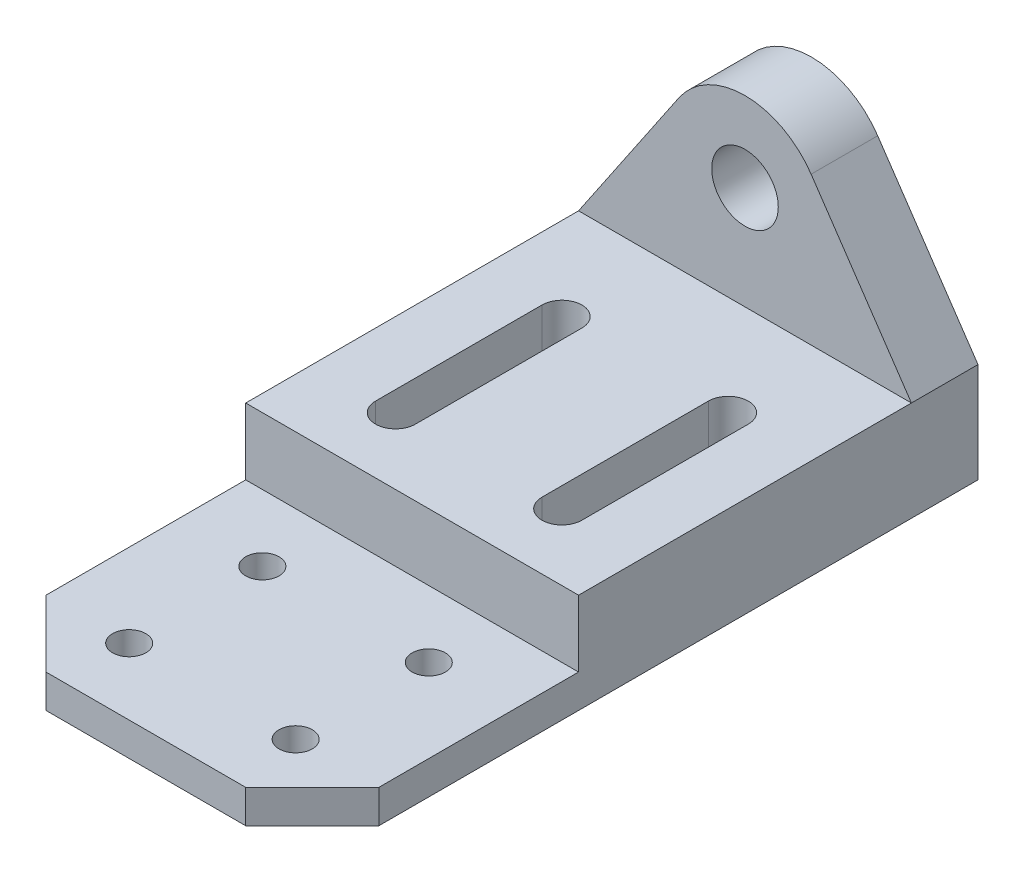
ISO-10303-21;
HEADER;
FILE_DESCRIPTION(('STEP AP214'),'2;1');
FILE_NAME('part.step','',(''),(''),'','','');
FILE_SCHEMA(('AUTOMOTIVE_DESIGN { 1 0 10303 214 1 1 1 1 }'));
ENDSEC;
DATA;
#1=APPLICATION_CONTEXT('core data for automotive mechanical design processes');
#2=APPLICATION_PROTOCOL_DEFINITION('international standard','automotive_design',2000,#1);
#3=PRODUCT_CONTEXT('',#1,'mechanical');
#4=PRODUCT('Part','Part','',(#3));
#5=PRODUCT_RELATED_PRODUCT_CATEGORY('part','',(#4));
#6=PRODUCT_DEFINITION_FORMATION('','',#4);
#7=PRODUCT_DEFINITION_CONTEXT('part definition',#1,'design');
#8=PRODUCT_DEFINITION('design','',#6,#7);
#9=PRODUCT_DEFINITION_SHAPE('','',#8);
#10=(LENGTH_UNIT() NAMED_UNIT(*) SI_UNIT(.MILLI.,.METRE.));
#11=(NAMED_UNIT(*) PLANE_ANGLE_UNIT() SI_UNIT($,.RADIAN.));
#12=(NAMED_UNIT(*) SI_UNIT($,.STERADIAN.) SOLID_ANGLE_UNIT());
#13=UNCERTAINTY_MEASURE_WITH_UNIT(LENGTH_MEASURE(1.E-05),#10,'distance_accuracy_value','');
#14=(GEOMETRIC_REPRESENTATION_CONTEXT(3) GLOBAL_UNCERTAINTY_ASSIGNED_CONTEXT((#13)) GLOBAL_UNIT_ASSIGNED_CONTEXT((#10,
#11,#12)) REPRESENTATION_CONTEXT('',''));
#15=CARTESIAN_POINT('',(0.,0.,0.));
#16=DIRECTION('',(0.,0.,1.));
#17=DIRECTION('',(1.,0.,0.));
#18=AXIS2_PLACEMENT_3D('',#15,#16,#17);
#19=CARTESIAN_POINT('',(-50.,30.,-80.));
#20=DIRECTION('',(0.,1.,0.));
#21=DIRECTION('',(0.,0.,1.));
#22=AXIS2_PLACEMENT_3D('',#19,#20,#21);
#23=PLANE('',#22);
#24=CARTESIAN_POINT('',(-25.,30.,-50.));
#25=DIRECTION('',(0.,1.,0.));
#26=DIRECTION('',(0.,0.,1.));
#27=AXIS2_PLACEMENT_3D('',#24,#25,#26);
#28=CIRCLE('',#27,6.);
#29=CARTESIAN_POINT('',(-19.,30.,-50.));
#30=VERTEX_POINT('',#29);
#31=CARTESIAN_POINT('',(-31.,30.,-50.));
#32=VERTEX_POINT('',#31);
#33=EDGE_CURVE('E240',#30,#32,#28,.T.);
#34=ORIENTED_EDGE('',*,*,#33,.F.);
#35=DIRECTION('',(0.,0.,-1.));
#36=VECTOR('',#35,1.);
#37=CARTESIAN_POINT('',(-19.,30.,-50.));
#38=LINE('',#37,#36);
#39=CARTESIAN_POINT('',(-19.,30.,0.));
#40=VERTEX_POINT('',#39);
#41=EDGE_CURVE('E229',#40,#30,#38,.T.);
#42=ORIENTED_EDGE('',*,*,#41,.F.);
#43=CARTESIAN_POINT('',(-25.,30.,0.));
#44=DIRECTION('',(0.,1.,0.));
#45=DIRECTION('',(0.,0.,1.));
#46=AXIS2_PLACEMENT_3D('',#43,#44,#45);
#47=CIRCLE('',#46,6.);
#48=CARTESIAN_POINT('',(-31.,30.,0.));
#49=VERTEX_POINT('',#48);
#50=EDGE_CURVE('E248',#49,#40,#47,.T.);
#51=ORIENTED_EDGE('',*,*,#50,.F.);
#52=DIRECTION('',(0.,0.,1.));
#53=VECTOR('',#52,1.);
#54=CARTESIAN_POINT('',(-31.,30.,-50.));
#55=LINE('',#54,#53);
#56=EDGE_CURVE('E243',#32,#49,#55,.T.);
#57=ORIENTED_EDGE('',*,*,#56,.F.);
#58=EDGE_LOOP('',(#34,#42,#51,#57));
#59=FACE_BOUND('',#58,.T.);
#60=CARTESIAN_POINT('',(25.,30.,-50.));
#61=DIRECTION('',(0.,1.,0.));
#62=DIRECTION('',(0.,0.,-1.));
#63=AXIS2_PLACEMENT_3D('',#60,#61,#62);
#64=CIRCLE('',#63,6.);
#65=CARTESIAN_POINT('',(31.,30.,-50.));
#66=VERTEX_POINT('',#65);
#67=CARTESIAN_POINT('',(19.,30.,-50.));
#68=VERTEX_POINT('',#67);
#69=EDGE_CURVE('E244',#66,#68,#64,.T.);
#70=ORIENTED_EDGE('',*,*,#69,.F.);
#71=DIRECTION('',(0.,0.,-1.));
#72=VECTOR('',#71,1.);
#73=CARTESIAN_POINT('',(31.,30.,-50.));
#74=LINE('',#73,#72);
#75=CARTESIAN_POINT('',(31.,30.,0.));
#76=VERTEX_POINT('',#75);
#77=EDGE_CURVE('E281',#76,#66,#74,.T.);
#78=ORIENTED_EDGE('',*,*,#77,.F.);
#79=CARTESIAN_POINT('',(25.,30.,0.));
#80=DIRECTION('',(0.,1.,0.));
#81=DIRECTION('',(0.,0.,-1.));
#82=AXIS2_PLACEMENT_3D('',#79,#80,#81);
#83=CIRCLE('',#82,6.);
#84=CARTESIAN_POINT('',(19.,30.,0.));
#85=VERTEX_POINT('',#84);
#86=EDGE_CURVE('E285',#85,#76,#83,.T.);
#87=ORIENTED_EDGE('',*,*,#86,.F.);
#88=DIRECTION('',(0.,0.,1.));
#89=VECTOR('',#88,1.);
#90=CARTESIAN_POINT('',(19.,30.,-50.));
#91=LINE('',#90,#89);
#92=EDGE_CURVE('E290',#68,#85,#91,.T.);
#93=ORIENTED_EDGE('',*,*,#92,.F.);
#94=EDGE_LOOP('',(#70,#78,#87,#93));
#95=FACE_BOUND('',#94,.T.);
#96=DIRECTION('',(0.,0.,1.));
#97=VECTOR('',#96,1.);
#98=CARTESIAN_POINT('',(50.,30.,-80.));
#99=LINE('',#98,#97);
#100=CARTESIAN_POINT('',(50.,30.,-80.));
#101=VERTEX_POINT('',#100);
#102=CARTESIAN_POINT('',(50.,30.,20.));
#103=VERTEX_POINT('',#102);
#104=EDGE_CURVE('E348',#101,#103,#99,.T.);
#105=ORIENTED_EDGE('',*,*,#104,.F.);
#106=DIRECTION('',(-1.,0.,0.));
#107=VECTOR('',#106,1.);
#108=CARTESIAN_POINT('',(-50.,30.,-80.));
#109=LINE('',#108,#107);
#110=CARTESIAN_POINT('',(-50.,30.,-80.));
#111=VERTEX_POINT('',#110);
#112=EDGE_CURVE('E191',#101,#111,#109,.T.);
#113=ORIENTED_EDGE('',*,*,#112,.T.);
#114=DIRECTION('',(0.,0.,1.));
#115=VECTOR('',#114,1.);
#116=CARTESIAN_POINT('',(-50.,30.,-80.));
#117=LINE('',#116,#115);
#118=CARTESIAN_POINT('',(-50.,30.,20.));
#119=VERTEX_POINT('',#118);
#120=EDGE_CURVE('E368',#111,#119,#117,.T.);
#121=ORIENTED_EDGE('',*,*,#120,.T.);
#122=DIRECTION('',(1.,0.,0.));
#123=VECTOR('',#122,1.);
#124=CARTESIAN_POINT('',(-50.,30.,20.));
#125=LINE('',#124,#123);
#126=EDGE_CURVE('E388',#119,#103,#125,.T.);
#127=ORIENTED_EDGE('',*,*,#126,.T.);
#128=EDGE_LOOP('',(#105,#113,#121,#127));
#129=FACE_BOUND('',#128,.T.);
#130=ADVANCED_FACE('F47',(#59,#95,#129),#23,.T.);
#131=CARTESIAN_POINT('',(-50.,0.,100.));
#132=DIRECTION('',(0.,-1.,0.));
#133=DIRECTION('',(0.,0.,-1.));
#134=AXIS2_PLACEMENT_3D('',#131,#132,#133);
#135=PLANE('',#134);
#136=CARTESIAN_POINT('',(-25.,0.,-50.));
#137=DIRECTION('',(0.,1.,0.));
#138=DIRECTION('',(0.,0.,1.));
#139=AXIS2_PLACEMENT_3D('',#136,#137,#138);
#140=CIRCLE('',#139,6.);
#141=CARTESIAN_POINT('',(-19.,0.,-50.));
#142=VERTEX_POINT('',#141);
#143=CARTESIAN_POINT('',(-31.,0.,-50.));
#144=VERTEX_POINT('',#143);
#145=EDGE_CURVE('E224',#142,#144,#140,.T.);
#146=ORIENTED_EDGE('',*,*,#145,.T.);
#147=DIRECTION('',(0.,0.,1.));
#148=VECTOR('',#147,1.);
#149=CARTESIAN_POINT('',(-31.,0.,-50.));
#150=LINE('',#149,#148);
#151=CARTESIAN_POINT('',(-31.,0.,0.));
#152=VERTEX_POINT('',#151);
#153=EDGE_CURVE('E228',#144,#152,#150,.T.);
#154=ORIENTED_EDGE('',*,*,#153,.T.);
#155=CARTESIAN_POINT('',(-25.,0.,0.));
#156=DIRECTION('',(0.,1.,0.));
#157=DIRECTION('',(0.,0.,1.));
#158=AXIS2_PLACEMENT_3D('',#155,#156,#157);
#159=CIRCLE('',#158,6.);
#160=CARTESIAN_POINT('',(-19.,0.,0.));
#161=VERTEX_POINT('',#160);
#162=EDGE_CURVE('E72',#152,#161,#159,.T.);
#163=ORIENTED_EDGE('',*,*,#162,.T.);
#164=DIRECTION('',(0.,0.,-1.));
#165=VECTOR('',#164,1.);
#166=CARTESIAN_POINT('',(-19.,0.,-50.));
#167=LINE('',#166,#165);
#168=EDGE_CURVE('E235',#161,#142,#167,.T.);
#169=ORIENTED_EDGE('',*,*,#168,.T.);
#170=EDGE_LOOP('',(#146,#154,#163,#169));
#171=FACE_BOUND('',#170,.T.);
#172=CARTESIAN_POINT('',(25.,0.,-50.));
#173=DIRECTION('',(0.,1.,0.));
#174=DIRECTION('',(0.,0.,-1.));
#175=AXIS2_PLACEMENT_3D('',#172,#173,#174);
#176=CIRCLE('',#175,6.);
#177=CARTESIAN_POINT('',(31.,0.,-50.));
#178=VERTEX_POINT('',#177);
#179=CARTESIAN_POINT('',(19.,0.,-50.));
#180=VERTEX_POINT('',#179);
#181=EDGE_CURVE('E286',#178,#180,#176,.T.);
#182=ORIENTED_EDGE('',*,*,#181,.T.);
#183=DIRECTION('',(0.,0.,1.));
#184=VECTOR('',#183,1.);
#185=CARTESIAN_POINT('',(19.,0.,-50.));
#186=LINE('',#185,#184);
#187=CARTESIAN_POINT('',(19.,0.,0.));
#188=VERTEX_POINT('',#187);
#189=EDGE_CURVE('E303',#180,#188,#186,.T.);
#190=ORIENTED_EDGE('',*,*,#189,.T.);
#191=CARTESIAN_POINT('',(25.,0.,0.));
#192=DIRECTION('',(0.,1.,0.));
#193=DIRECTION('',(0.,0.,-1.));
#194=AXIS2_PLACEMENT_3D('',#191,#192,#193);
#195=CIRCLE('',#194,6.);
#196=CARTESIAN_POINT('',(31.,0.,0.));
#197=VERTEX_POINT('',#196);
#198=EDGE_CURVE('E299',#188,#197,#195,.T.);
#199=ORIENTED_EDGE('',*,*,#198,.T.);
#200=DIRECTION('',(0.,0.,-1.));
#201=VECTOR('',#200,1.);
#202=CARTESIAN_POINT('',(31.,0.,-50.));
#203=LINE('',#202,#201);
#204=EDGE_CURVE('E272',#197,#178,#203,.T.);
#205=ORIENTED_EDGE('',*,*,#204,.T.);
#206=EDGE_LOOP('',(#182,#190,#199,#205));
#207=FACE_BOUND('',#206,.T.);
#208=DIRECTION('',(1.,0.,0.));
#209=VECTOR('',#208,1.);
#210=CARTESIAN_POINT('',(-50.,0.,100.));
#211=LINE('',#210,#209);
#212=CARTESIAN_POINT('',(-30.,0.,100.));
#213=VERTEX_POINT('',#212);
#214=CARTESIAN_POINT('',(29.9999999999999,0.,100.));
#215=VERTEX_POINT('',#214);
#216=EDGE_CURVE('E379',#213,#215,#211,.T.);
#217=ORIENTED_EDGE('',*,*,#216,.F.);
#218=DIRECTION('',(-0.707106781186548,0.,-0.707106781186548));
#219=VECTOR('',#218,1.);
#220=CARTESIAN_POINT('',(-40.,0.,90.));
#221=LINE('',#220,#219);
#222=CARTESIAN_POINT('',(-50.,0.,80.));
#223=VERTEX_POINT('',#222);
#224=EDGE_CURVE('E408',#213,#223,#221,.T.);
#225=ORIENTED_EDGE('',*,*,#224,.T.);
#226=DIRECTION('',(0.,0.,-1.));
#227=VECTOR('',#226,1.);
#228=CARTESIAN_POINT('',(-50.,0.,100.));
#229=LINE('',#228,#227);
#230=CARTESIAN_POINT('',(-50.,0.,-100.));
#231=VERTEX_POINT('',#230);
#232=EDGE_CURVE('E361',#223,#231,#229,.T.);
#233=ORIENTED_EDGE('',*,*,#232,.T.);
#234=DIRECTION('',(1.,0.,0.));
#235=VECTOR('',#234,1.);
#236=CARTESIAN_POINT('',(-50.,0.,-100.));
#237=LINE('',#236,#235);
#238=CARTESIAN_POINT('',(50.,0.,-100.));
#239=VERTEX_POINT('',#238);
#240=EDGE_CURVE('E392',#231,#239,#237,.T.);
#241=ORIENTED_EDGE('',*,*,#240,.T.);
#242=DIRECTION('',(0.,0.,-1.));
#243=VECTOR('',#242,1.);
#244=CARTESIAN_POINT('',(50.,0.,100.));
#245=LINE('',#244,#243);
#246=CARTESIAN_POINT('',(50.,0.,79.9999999999999));
#247=VERTEX_POINT('',#246);
#248=EDGE_CURVE('E341',#247,#239,#245,.T.);
#249=ORIENTED_EDGE('',*,*,#248,.F.);
#250=DIRECTION('',(0.707106781186548,0.,-0.707106781186548));
#251=VECTOR('',#250,1.);
#252=CARTESIAN_POINT('',(-10.,0.,140.));
#253=LINE('',#252,#251);
#254=EDGE_CURVE('E405',#247,#215,#253,.F.);
#255=ORIENTED_EDGE('',*,*,#254,.T.);
#256=EDGE_LOOP('',(#217,#225,#233,#241,#249,#255));
#257=FACE_BOUND('',#256,.T.);
#258=CARTESIAN_POINT('',(-25.,0.,80.));
#259=DIRECTION('',(0.,1.,0.));
#260=DIRECTION('',(0.,0.,1.));
#261=AXIS2_PLACEMENT_3D('',#258,#259,#260);
#262=CIRCLE('',#261,5.00000000000002);
#263=CARTESIAN_POINT('',(-25.,0.,85.));
#264=VERTEX_POINT('',#263);
#265=EDGE_CURVE('E337',#264,#264,#262,.T.);
#266=ORIENTED_EDGE('',*,*,#265,.T.);
#267=EDGE_LOOP('',(#266));
#268=FACE_BOUND('',#267,.T.);
#269=CARTESIAN_POINT('',(-25.,0.,40.));
#270=DIRECTION('',(0.,1.,0.));
#271=DIRECTION('',(0.,0.,1.));
#272=AXIS2_PLACEMENT_3D('',#269,#270,#271);
#273=CIRCLE('',#272,5.00000000000002);
#274=CARTESIAN_POINT('',(-25.,0.,45.));
#275=VERTEX_POINT('',#274);
#276=EDGE_CURVE('E329',#275,#275,#273,.T.);
#277=ORIENTED_EDGE('',*,*,#276,.T.);
#278=EDGE_LOOP('',(#277));
#279=FACE_BOUND('',#278,.T.);
#280=CARTESIAN_POINT('',(25.,0.,80.));
#281=DIRECTION('',(0.,1.,0.));
#282=DIRECTION('',(0.,0.,1.));
#283=AXIS2_PLACEMENT_3D('',#280,#281,#282);
#284=CIRCLE('',#283,5.00000000000002);
#285=CARTESIAN_POINT('',(25.,0.,85.));
#286=VERTEX_POINT('',#285);
#287=EDGE_CURVE('E321',#286,#286,#284,.T.);
#288=ORIENTED_EDGE('',*,*,#287,.T.);
#289=EDGE_LOOP('',(#288));
#290=FACE_BOUND('',#289,.T.);
#291=CARTESIAN_POINT('',(25.,0.,40.));
#292=DIRECTION('',(0.,1.,0.));
#293=DIRECTION('',(0.,0.,1.));
#294=AXIS2_PLACEMENT_3D('',#291,#292,#293);
#295=CIRCLE('',#294,5.00000000000002);
#296=CARTESIAN_POINT('',(25.,0.,45.));
#297=VERTEX_POINT('',#296);
#298=EDGE_CURVE('E313',#297,#297,#295,.T.);
#299=ORIENTED_EDGE('',*,*,#298,.T.);
#300=EDGE_LOOP('',(#299));
#301=FACE_BOUND('',#300,.T.);
#302=ADVANCED_FACE('F433',(#171,#207,#257,#268,#279,#290,#301),#135,.T.);
#303=CARTESIAN_POINT('',(-50.,10.,100.));
#304=DIRECTION('',(0.,0.,1.));
#305=DIRECTION('',(1.,0.,0.));
#306=AXIS2_PLACEMENT_3D('',#303,#304,#305);
#307=PLANE('',#306);
#308=DIRECTION('',(1.,0.,0.));
#309=VECTOR('',#308,1.);
#310=CARTESIAN_POINT('',(-50.,10.,100.));
#311=LINE('',#310,#309);
#312=CARTESIAN_POINT('',(-30.,10.,100.));
#313=VERTEX_POINT('',#312);
#314=CARTESIAN_POINT('',(29.9999999999999,10.,100.));
#315=VERTEX_POINT('',#314);
#316=EDGE_CURVE('E380',#313,#315,#311,.T.);
#317=ORIENTED_EDGE('',*,*,#316,.F.);
#318=DIRECTION('',(0.,-1.,0.));
#319=VECTOR('',#318,1.);
#320=CARTESIAN_POINT('',(-30.,0.,100.));
#321=LINE('',#320,#319);
#322=EDGE_CURVE('E401',#313,#213,#321,.T.);
#323=ORIENTED_EDGE('',*,*,#322,.T.);
#324=ORIENTED_EDGE('',*,*,#216,.T.);
#325=DIRECTION('',(0.,1.,0.));
#326=VECTOR('',#325,1.);
#327=CARTESIAN_POINT('',(29.9999999999999,10.,100.));
#328=LINE('',#327,#326);
#329=EDGE_CURVE('E384',#215,#315,#328,.T.);
#330=ORIENTED_EDGE('',*,*,#329,.T.);
#331=EDGE_LOOP('',(#317,#323,#324,#330));
#332=FACE_BOUND('',#331,.T.);
#333=ADVANCED_FACE('F427',(#332),#307,.T.);
#334=CARTESIAN_POINT('',(-50.,10.,20.));
#335=DIRECTION('',(0.,1.,0.));
#336=DIRECTION('',(0.,0.,1.));
#337=AXIS2_PLACEMENT_3D('',#334,#335,#336);
#338=PLANE('',#337);
#339=CARTESIAN_POINT('',(25.,10.,40.));
#340=DIRECTION('',(0.,1.,0.));
#341=DIRECTION('',(0.,0.,1.));
#342=AXIS2_PLACEMENT_3D('',#339,#340,#341);
#343=CIRCLE('',#342,5.00000000000002);
#344=CARTESIAN_POINT('',(25.,10.,45.));
#345=VERTEX_POINT('',#344);
#346=EDGE_CURVE('E258',#345,#345,#343,.T.);
#347=ORIENTED_EDGE('',*,*,#346,.F.);
#348=EDGE_LOOP('',(#347));
#349=FACE_BOUND('',#348,.T.);
#350=CARTESIAN_POINT('',(25.,10.,80.));
#351=DIRECTION('',(0.,1.,0.));
#352=DIRECTION('',(0.,0.,1.));
#353=AXIS2_PLACEMENT_3D('',#350,#351,#352);
#354=CIRCLE('',#353,5.00000000000002);
#355=CARTESIAN_POINT('',(25.,10.,85.));
#356=VERTEX_POINT('',#355);
#357=EDGE_CURVE('E317',#356,#356,#354,.T.);
#358=ORIENTED_EDGE('',*,*,#357,.F.);
#359=EDGE_LOOP('',(#358));
#360=FACE_BOUND('',#359,.T.);
#361=CARTESIAN_POINT('',(-25.,10.,40.));
#362=DIRECTION('',(0.,1.,0.));
#363=DIRECTION('',(0.,0.,1.));
#364=AXIS2_PLACEMENT_3D('',#361,#362,#363);
#365=CIRCLE('',#364,5.00000000000002);
#366=CARTESIAN_POINT('',(-25.,10.,45.));
#367=VERTEX_POINT('',#366);
#368=EDGE_CURVE('E325',#367,#367,#365,.T.);
#369=ORIENTED_EDGE('',*,*,#368,.F.);
#370=EDGE_LOOP('',(#369));
#371=FACE_BOUND('',#370,.T.);
#372=CARTESIAN_POINT('',(-25.,10.,80.));
#373=DIRECTION('',(0.,1.,0.));
#374=DIRECTION('',(0.,0.,1.));
#375=AXIS2_PLACEMENT_3D('',#372,#373,#374);
#376=CIRCLE('',#375,5.00000000000002);
#377=CARTESIAN_POINT('',(-25.,10.,85.));
#378=VERTEX_POINT('',#377);
#379=EDGE_CURVE('E333',#378,#378,#376,.T.);
#380=ORIENTED_EDGE('',*,*,#379,.F.);
#381=EDGE_LOOP('',(#380));
#382=FACE_BOUND('',#381,.T.);
#383=DIRECTION('',(0.,0.,1.));
#384=VECTOR('',#383,1.);
#385=CARTESIAN_POINT('',(-50.,10.,20.));
#386=LINE('',#385,#384);
#387=CARTESIAN_POINT('',(-50.,10.,20.));
#388=VERTEX_POINT('',#387);
#389=CARTESIAN_POINT('',(-50.,10.,80.));
#390=VERTEX_POINT('',#389);
#391=EDGE_CURVE('E375',#388,#390,#386,.T.);
#392=ORIENTED_EDGE('',*,*,#391,.T.);
#393=DIRECTION('',(0.707106781186548,0.,0.707106781186548));
#394=VECTOR('',#393,1.);
#395=CARTESIAN_POINT('',(-80.,10.,50.));
#396=LINE('',#395,#394);
#397=EDGE_CURVE('E57',#390,#313,#396,.T.);
#398=ORIENTED_EDGE('',*,*,#397,.T.);
#399=ORIENTED_EDGE('',*,*,#316,.T.);
#400=DIRECTION('',(-0.707106781186548,0.,0.707106781186548));
#401=VECTOR('',#400,1.);
#402=CARTESIAN_POINT('',(29.9999999999999,10.,99.9999999999999));
#403=LINE('',#402,#401);
#404=CARTESIAN_POINT('',(50.,10.,79.9999999999999));
#405=VERTEX_POINT('',#404);
#406=EDGE_CURVE('E414',#315,#405,#403,.F.);
#407=ORIENTED_EDGE('',*,*,#406,.T.);
#408=DIRECTION('',(0.,0.,1.));
#409=VECTOR('',#408,1.);
#410=CARTESIAN_POINT('',(50.,10.,20.));
#411=LINE('',#410,#409);
#412=CARTESIAN_POINT('',(50.,10.,20.));
#413=VERTEX_POINT('',#412);
#414=EDGE_CURVE('E357',#413,#405,#411,.T.);
#415=ORIENTED_EDGE('',*,*,#414,.F.);
#416=DIRECTION('',(1.,0.,0.));
#417=VECTOR('',#416,1.);
#418=CARTESIAN_POINT('',(-50.,10.,20.));
#419=LINE('',#418,#417);
#420=EDGE_CURVE('E385',#388,#413,#419,.T.);
#421=ORIENTED_EDGE('',*,*,#420,.F.);
#422=EDGE_LOOP('',(#392,#398,#399,#407,#415,#421));
#423=FACE_BOUND('',#422,.T.);
#424=ADVANCED_FACE('F420',(#349,#360,#371,#382,#423),#338,.T.);
#425=CARTESIAN_POINT('',(-50.,30.,20.));
#426=DIRECTION('',(0.,0.,1.));
#427=DIRECTION('',(1.,0.,0.));
#428=AXIS2_PLACEMENT_3D('',#425,#426,#427);
#429=PLANE('',#428);
#430=ORIENTED_EDGE('',*,*,#420,.T.);
#431=DIRECTION('',(0.,-1.,0.));
#432=VECTOR('',#431,1.);
#433=CARTESIAN_POINT('',(50.,30.,20.));
#434=LINE('',#433,#432);
#435=EDGE_CURVE('E353',#103,#413,#434,.T.);
#436=ORIENTED_EDGE('',*,*,#435,.F.);
#437=ORIENTED_EDGE('',*,*,#126,.F.);
#438=DIRECTION('',(0.,-1.,0.));
#439=VECTOR('',#438,1.);
#440=CARTESIAN_POINT('',(-50.,30.,20.));
#441=LINE('',#440,#439);
#442=EDGE_CURVE('E371',#119,#388,#441,.T.);
#443=ORIENTED_EDGE('',*,*,#442,.T.);
#444=EDGE_LOOP('',(#430,#436,#437,#443));
#445=FACE_BOUND('',#444,.T.);
#446=ADVANCED_FACE('F453',(#445),#429,.T.);
#447=CARTESIAN_POINT('',(-50.,0.,-100.));
#448=DIRECTION('',(0.,0.,-1.));
#449=DIRECTION('',(-1.,0.,0.));
#450=AXIS2_PLACEMENT_3D('',#447,#448,#449);
#451=PLANE('',#450);
#452=CARTESIAN_POINT('',(0.,61.,-100.));
#453=DIRECTION('',(0.,0.,1.));
#454=DIRECTION('',(1.,0.,0.));
#455=AXIS2_PLACEMENT_3D('',#452,#453,#454);
#456=CIRCLE('',#455,10.);
#457=CARTESIAN_POINT('',(10.,61.,-100.));
#458=VERTEX_POINT('',#457);
#459=EDGE_CURVE('E209',#458,#458,#456,.T.);
#460=ORIENTED_EDGE('',*,*,#459,.T.);
#461=EDGE_LOOP('',(#460));
#462=FACE_BOUND('',#461,.T.);
#463=DIRECTION('',(0.,1.,0.));
#464=VECTOR('',#463,1.);
#465=CARTESIAN_POINT('',(-50.,0.,-100.));
#466=LINE('',#465,#464);
#467=CARTESIAN_POINT('',(-50.,30.,-100.));
#468=VERTEX_POINT('',#467);
#469=EDGE_CURVE('E364',#231,#468,#466,.T.);
#470=ORIENTED_EDGE('',*,*,#469,.T.);
#471=DIRECTION('',(0.560996764056387,0.82781799371496,0.));
#472=VECTOR('',#471,1.);
#473=CARTESIAN_POINT('',(-50.,30.,-100.));
#474=LINE('',#473,#472);
#475=CARTESIAN_POINT('',(-19.867631849159,74.4639223373533,-100.));
#476=VERTEX_POINT('',#475);
#477=EDGE_CURVE('E216',#468,#476,#474,.T.);
#478=ORIENTED_EDGE('',*,*,#477,.T.);
#479=CARTESIAN_POINT('',(0.,61.,-100.));
#480=DIRECTION('',(0.,0.,-1.));
#481=DIRECTION('',(-1.,0.,0.));
#482=AXIS2_PLACEMENT_3D('',#479,#480,#481);
#483=CIRCLE('',#482,24.);
#484=CARTESIAN_POINT('',(19.867631849159,74.4639223373533,-100.));
#485=VERTEX_POINT('',#484);
#486=EDGE_CURVE('E186',#476,#485,#483,.T.);
#487=ORIENTED_EDGE('',*,*,#486,.T.);
#488=DIRECTION('',(0.560996764056388,-0.82781799371496,0.));
#489=VECTOR('',#488,1.);
#490=CARTESIAN_POINT('',(50.,30.,-100.));
#491=LINE('',#490,#489);
#492=CARTESIAN_POINT('',(50.,30.,-100.));
#493=VERTEX_POINT('',#492);
#494=EDGE_CURVE('E203',#485,#493,#491,.T.);
#495=ORIENTED_EDGE('',*,*,#494,.T.);
#496=DIRECTION('',(0.,1.,0.));
#497=VECTOR('',#496,1.);
#498=CARTESIAN_POINT('',(50.,0.,-100.));
#499=LINE('',#498,#497);
#500=EDGE_CURVE('E344',#239,#493,#499,.T.);
#501=ORIENTED_EDGE('',*,*,#500,.F.);
#502=ORIENTED_EDGE('',*,*,#240,.F.);
#503=EDGE_LOOP('',(#470,#478,#487,#495,#501,#502));
#504=FACE_BOUND('',#503,.T.);
#505=ADVANCED_FACE('F441',(#462,#504),#451,.T.);
#506=CARTESIAN_POINT('',(-50.,0.,0.));
#507=DIRECTION('',(1.,0.,0.));
#508=DIRECTION('',(0.,0.,-1.));
#509=AXIS2_PLACEMENT_3D('',#506,#507,#508);
#510=PLANE('',#509);
#511=EDGE_CURVE('E200',#468,#111,#117,.T.);
#512=ORIENTED_EDGE('',*,*,#511,.F.);
#513=ORIENTED_EDGE('',*,*,#469,.F.);
#514=ORIENTED_EDGE('',*,*,#232,.F.);
#515=DIRECTION('',(0.,1.,0.));
#516=VECTOR('',#515,1.);
#517=CARTESIAN_POINT('',(-50.,10.,80.));
#518=LINE('',#517,#516);
#519=EDGE_CURVE('E411',#223,#390,#518,.T.);
#520=ORIENTED_EDGE('',*,*,#519,.T.);
#521=ORIENTED_EDGE('',*,*,#391,.F.);
#522=ORIENTED_EDGE('',*,*,#442,.F.);
#523=ORIENTED_EDGE('',*,*,#120,.F.);
#524=EDGE_LOOP('',(#512,#513,#514,#520,#521,#522,#523));
#525=FACE_BOUND('',#524,.T.);
#526=ADVANCED_FACE('F438',(#525),#510,.F.);
#527=CARTESIAN_POINT('',(50.,0.,0.));
#528=DIRECTION('',(1.,0.,0.));
#529=DIRECTION('',(0.,0.,-1.));
#530=AXIS2_PLACEMENT_3D('',#527,#528,#529);
#531=PLANE('',#530);
#532=ORIENTED_EDGE('',*,*,#500,.T.);
#533=EDGE_CURVE('E349',#493,#101,#99,.T.);
#534=ORIENTED_EDGE('',*,*,#533,.T.);
#535=ORIENTED_EDGE('',*,*,#104,.T.);
#536=ORIENTED_EDGE('',*,*,#435,.T.);
#537=ORIENTED_EDGE('',*,*,#414,.T.);
#538=DIRECTION('',(0.,-1.,0.));
#539=VECTOR('',#538,1.);
#540=CARTESIAN_POINT('',(50.,0.,79.9999999999999));
#541=LINE('',#540,#539);
#542=EDGE_CURVE('E11',#405,#247,#541,.T.);
#543=ORIENTED_EDGE('',*,*,#542,.T.);
#544=ORIENTED_EDGE('',*,*,#248,.T.);
#545=EDGE_LOOP('',(#532,#534,#535,#536,#537,#543,#544));
#546=FACE_BOUND('',#545,.T.);
#547=ADVANCED_FACE('F445',(#546),#531,.T.);
#548=CARTESIAN_POINT('',(-30.,10.,100.));
#549=DIRECTION('',(-0.707106781186548,0.,0.707106781186548));
#550=DIRECTION('',(0.,1.,0.));
#551=AXIS2_PLACEMENT_3D('',#548,#549,#550);
#552=PLANE('',#551);
#553=ORIENTED_EDGE('',*,*,#397,.F.);
#554=ORIENTED_EDGE('',*,*,#519,.F.);
#555=ORIENTED_EDGE('',*,*,#224,.F.);
#556=ORIENTED_EDGE('',*,*,#322,.F.);
#557=EDGE_LOOP('',(#553,#554,#555,#556));
#558=FACE_BOUND('',#557,.T.);
#559=ADVANCED_FACE('F430',(#558),#552,.T.);
#560=CARTESIAN_POINT('',(50.,0.,79.9999999999999));
#561=DIRECTION('',(-0.707106781186548,0.,-0.707106781186548));
#562=DIRECTION('',(0.,-1.,0.));
#563=AXIS2_PLACEMENT_3D('',#560,#561,#562);
#564=PLANE('',#563);
#565=ORIENTED_EDGE('',*,*,#406,.F.);
#566=ORIENTED_EDGE('',*,*,#329,.F.);
#567=ORIENTED_EDGE('',*,*,#254,.F.);
#568=ORIENTED_EDGE('',*,*,#542,.F.);
#569=EDGE_LOOP('',(#565,#566,#567,#568));
#570=FACE_BOUND('',#569,.T.);
#571=ADVANCED_FACE('F50',(#570),#564,.F.);
#572=CARTESIAN_POINT('',(-25.,10.,80.));
#573=DIRECTION('',(0.,1.,0.));
#574=DIRECTION('',(0.,0.,1.));
#575=AXIS2_PLACEMENT_3D('',#572,#573,#574);
#576=CYLINDRICAL_SURFACE('',#575,5.00000000000002);
#577=ORIENTED_EDGE('',*,*,#265,.F.);
#578=EDGE_LOOP('',(#577));
#579=FACE_BOUND('',#578,.T.);
#580=ORIENTED_EDGE('',*,*,#379,.T.);
#581=EDGE_LOOP('',(#580));
#582=FACE_BOUND('',#581,.T.);
#583=ADVANCED_FACE('F484',(#579,#582),#576,.F.);
#584=CARTESIAN_POINT('',(-25.,10.,40.));
#585=DIRECTION('',(0.,1.,0.));
#586=DIRECTION('',(0.,0.,1.));
#587=AXIS2_PLACEMENT_3D('',#584,#585,#586);
#588=CYLINDRICAL_SURFACE('',#587,5.00000000000002);
#589=ORIENTED_EDGE('',*,*,#276,.F.);
#590=EDGE_LOOP('',(#589));
#591=FACE_BOUND('',#590,.T.);
#592=ORIENTED_EDGE('',*,*,#368,.T.);
#593=EDGE_LOOP('',(#592));
#594=FACE_BOUND('',#593,.T.);
#595=ADVANCED_FACE('F509',(#591,#594),#588,.F.);
#596=CARTESIAN_POINT('',(25.,10.,80.));
#597=DIRECTION('',(0.,1.,0.));
#598=DIRECTION('',(0.,0.,1.));
#599=AXIS2_PLACEMENT_3D('',#596,#597,#598);
#600=CYLINDRICAL_SURFACE('',#599,5.00000000000002);
#601=ORIENTED_EDGE('',*,*,#287,.F.);
#602=EDGE_LOOP('',(#601));
#603=FACE_BOUND('',#602,.T.);
#604=ORIENTED_EDGE('',*,*,#357,.T.);
#605=EDGE_LOOP('',(#604));
#606=FACE_BOUND('',#605,.T.);
#607=ADVANCED_FACE('F513',(#603,#606),#600,.F.);
#608=CARTESIAN_POINT('',(25.,10.,40.));
#609=DIRECTION('',(0.,1.,0.));
#610=DIRECTION('',(0.,0.,1.));
#611=AXIS2_PLACEMENT_3D('',#608,#609,#610);
#612=CYLINDRICAL_SURFACE('',#611,5.00000000000002);
#613=ORIENTED_EDGE('',*,*,#298,.F.);
#614=EDGE_LOOP('',(#613));
#615=FACE_BOUND('',#614,.T.);
#616=ORIENTED_EDGE('',*,*,#346,.T.);
#617=EDGE_LOOP('',(#616));
#618=FACE_BOUND('',#617,.T.);
#619=ADVANCED_FACE('F523',(#615,#618),#612,.F.);
#620=CARTESIAN_POINT('',(25.,0.,-50.));
#621=DIRECTION('',(0.,1.,0.));
#622=DIRECTION('',(0.,0.,1.));
#623=AXIS2_PLACEMENT_3D('',#620,#621,#622);
#624=CYLINDRICAL_SURFACE('',#623,6.);
#625=ORIENTED_EDGE('',*,*,#69,.T.);
#626=DIRECTION('',(0.,1.,0.));
#627=VECTOR('',#626,1.);
#628=CARTESIAN_POINT('',(19.,0.,-50.));
#629=LINE('',#628,#627);
#630=EDGE_CURVE('E268',#180,#68,#629,.T.);
#631=ORIENTED_EDGE('',*,*,#630,.F.);
#632=ORIENTED_EDGE('',*,*,#181,.F.);
#633=DIRECTION('',(0.,1.,0.));
#634=VECTOR('',#633,1.);
#635=CARTESIAN_POINT('',(31.,0.,-50.));
#636=LINE('',#635,#634);
#637=EDGE_CURVE('E222',#178,#66,#636,.T.);
#638=ORIENTED_EDGE('',*,*,#637,.T.);
#639=EDGE_LOOP('',(#625,#631,#632,#638));
#640=FACE_BOUND('',#639,.T.);
#641=ADVANCED_FACE('F526',(#640),#624,.F.);
#642=CARTESIAN_POINT('',(31.,0.,-50.));
#643=DIRECTION('',(1.,0.,0.));
#644=DIRECTION('',(0.,0.,-1.));
#645=AXIS2_PLACEMENT_3D('',#642,#643,#644);
#646=PLANE('',#645);
#647=ORIENTED_EDGE('',*,*,#77,.T.);
#648=ORIENTED_EDGE('',*,*,#637,.F.);
#649=ORIENTED_EDGE('',*,*,#204,.F.);
#650=DIRECTION('',(0.,1.,0.));
#651=VECTOR('',#650,1.);
#652=CARTESIAN_POINT('',(31.,0.,0.));
#653=LINE('',#652,#651);
#654=EDGE_CURVE('E276',#197,#76,#653,.T.);
#655=ORIENTED_EDGE('',*,*,#654,.T.);
#656=EDGE_LOOP('',(#647,#648,#649,#655));
#657=FACE_BOUND('',#656,.T.);
#658=ADVANCED_FACE('F531',(#657),#646,.F.);
#659=CARTESIAN_POINT('',(25.,0.,0.));
#660=DIRECTION('',(0.,1.,0.));
#661=DIRECTION('',(0.,0.,1.));
#662=AXIS2_PLACEMENT_3D('',#659,#660,#661);
#663=CYLINDRICAL_SURFACE('',#662,6.);
#664=ORIENTED_EDGE('',*,*,#86,.T.);
#665=ORIENTED_EDGE('',*,*,#654,.F.);
#666=ORIENTED_EDGE('',*,*,#198,.F.);
#667=DIRECTION('',(0.,1.,0.));
#668=VECTOR('',#667,1.);
#669=CARTESIAN_POINT('',(19.,0.,0.));
#670=LINE('',#669,#668);
#671=EDGE_CURVE('E273',#188,#85,#670,.T.);
#672=ORIENTED_EDGE('',*,*,#671,.T.);
#673=EDGE_LOOP('',(#664,#665,#666,#672));
#674=FACE_BOUND('',#673,.T.);
#675=ADVANCED_FACE('F539',(#674),#663,.F.);
#676=CARTESIAN_POINT('',(19.,0.,-50.));
#677=DIRECTION('',(-1.,0.,0.));
#678=DIRECTION('',(0.,0.,1.));
#679=AXIS2_PLACEMENT_3D('',#676,#677,#678);
#680=PLANE('',#679);
#681=ORIENTED_EDGE('',*,*,#92,.T.);
#682=ORIENTED_EDGE('',*,*,#671,.F.);
#683=ORIENTED_EDGE('',*,*,#189,.F.);
#684=ORIENTED_EDGE('',*,*,#630,.T.);
#685=EDGE_LOOP('',(#681,#682,#683,#684));
#686=FACE_BOUND('',#685,.T.);
#687=ADVANCED_FACE('F543',(#686),#680,.F.);
#688=CARTESIAN_POINT('',(-25.,0.,-50.));
#689=DIRECTION('',(0.,1.,0.));
#690=DIRECTION('',(0.,0.,1.));
#691=AXIS2_PLACEMENT_3D('',#688,#689,#690);
#692=CYLINDRICAL_SURFACE('',#691,6.);
#693=ORIENTED_EDGE('',*,*,#33,.T.);
#694=DIRECTION('',(0.,1.,0.));
#695=VECTOR('',#694,1.);
#696=CARTESIAN_POINT('',(-31.,0.,-50.));
#697=LINE('',#696,#695);
#698=EDGE_CURVE('E239',#144,#32,#697,.T.);
#699=ORIENTED_EDGE('',*,*,#698,.F.);
#700=ORIENTED_EDGE('',*,*,#145,.F.);
#701=DIRECTION('',(0.,1.,0.));
#702=VECTOR('',#701,1.);
#703=CARTESIAN_POINT('',(-19.,0.,-50.));
#704=LINE('',#703,#702);
#705=EDGE_CURVE('E255',#142,#30,#704,.T.);
#706=ORIENTED_EDGE('',*,*,#705,.T.);
#707=EDGE_LOOP('',(#693,#699,#700,#706));
#708=FACE_BOUND('',#707,.T.);
#709=ADVANCED_FACE('F546',(#708),#692,.F.);
#710=CARTESIAN_POINT('',(-19.,0.,-50.));
#711=DIRECTION('',(1.,0.,0.));
#712=DIRECTION('',(0.,0.,-1.));
#713=AXIS2_PLACEMENT_3D('',#710,#711,#712);
#714=PLANE('',#713);
#715=ORIENTED_EDGE('',*,*,#41,.T.);
#716=ORIENTED_EDGE('',*,*,#705,.F.);
#717=ORIENTED_EDGE('',*,*,#168,.F.);
#718=DIRECTION('',(0.,1.,0.));
#719=VECTOR('',#718,1.);
#720=CARTESIAN_POINT('',(-19.,0.,0.));
#721=LINE('',#720,#719);
#722=EDGE_CURVE('E259',#161,#40,#721,.T.);
#723=ORIENTED_EDGE('',*,*,#722,.T.);
#724=EDGE_LOOP('',(#715,#716,#717,#723));
#725=FACE_BOUND('',#724,.T.);
#726=ADVANCED_FACE('F551',(#725),#714,.F.);
#727=CARTESIAN_POINT('',(-25.,0.,0.));
#728=DIRECTION('',(0.,1.,0.));
#729=DIRECTION('',(0.,0.,1.));
#730=AXIS2_PLACEMENT_3D('',#727,#728,#729);
#731=CYLINDRICAL_SURFACE('',#730,6.);
#732=ORIENTED_EDGE('',*,*,#50,.T.);
#733=ORIENTED_EDGE('',*,*,#722,.F.);
#734=ORIENTED_EDGE('',*,*,#162,.F.);
#735=DIRECTION('',(0.,1.,0.));
#736=VECTOR('',#735,1.);
#737=CARTESIAN_POINT('',(-31.,0.,0.));
#738=LINE('',#737,#736);
#739=EDGE_CURVE('E262',#152,#49,#738,.T.);
#740=ORIENTED_EDGE('',*,*,#739,.T.);
#741=EDGE_LOOP('',(#732,#733,#734,#740));
#742=FACE_BOUND('',#741,.T.);
#743=ADVANCED_FACE('F555',(#742),#731,.F.);
#744=CARTESIAN_POINT('',(-31.,0.,-50.));
#745=DIRECTION('',(-1.,0.,0.));
#746=DIRECTION('',(0.,0.,1.));
#747=AXIS2_PLACEMENT_3D('',#744,#745,#746);
#748=PLANE('',#747);
#749=ORIENTED_EDGE('',*,*,#56,.T.);
#750=ORIENTED_EDGE('',*,*,#739,.F.);
#751=ORIENTED_EDGE('',*,*,#153,.F.);
#752=ORIENTED_EDGE('',*,*,#698,.T.);
#753=EDGE_LOOP('',(#749,#750,#751,#752));
#754=FACE_BOUND('',#753,.T.);
#755=ADVANCED_FACE('F553',(#754),#748,.F.);
#756=CARTESIAN_POINT('',(-50.,30.,-80.));
#757=DIRECTION('',(-0.82781799371496,0.560996764056387,0.));
#758=DIRECTION('',(-0.560996764056387,-0.82781799371496,0.));
#759=AXIS2_PLACEMENT_3D('',#756,#757,#758);
#760=PLANE('',#759);
#761=ORIENTED_EDGE('',*,*,#477,.F.);
#762=ORIENTED_EDGE('',*,*,#511,.T.);
#763=DIRECTION('',(0.560996764056387,0.82781799371496,0.));
#764=VECTOR('',#763,1.);
#765=CARTESIAN_POINT('',(-50.,30.,-80.));
#766=LINE('',#765,#764);
#767=CARTESIAN_POINT('',(-19.867631849159,74.4639223373533,-80.));
#768=VERTEX_POINT('',#767);
#769=EDGE_CURVE('E64',#111,#768,#766,.T.);
#770=ORIENTED_EDGE('',*,*,#769,.T.);
#771=DIRECTION('',(0.,0.,-1.));
#772=VECTOR('',#771,1.);
#773=CARTESIAN_POINT('',(-19.867631849159,74.4639223373533,-80.));
#774=LINE('',#773,#772);
#775=EDGE_CURVE('E182',#768,#476,#774,.T.);
#776=ORIENTED_EDGE('',*,*,#775,.T.);
#777=EDGE_LOOP('',(#761,#762,#770,#776));
#778=FACE_BOUND('',#777,.T.);
#779=ADVANCED_FACE('F198',(#778),#760,.T.);
#780=CARTESIAN_POINT('',(50.,30.,-80.));
#781=DIRECTION('',(0.82781799371496,0.560996764056388,0.));
#782=DIRECTION('',(-0.560996764056388,0.82781799371496,0.));
#783=AXIS2_PLACEMENT_3D('',#780,#781,#782);
#784=PLANE('',#783);
#785=ORIENTED_EDGE('',*,*,#494,.F.);
#786=DIRECTION('',(0.,0.,-1.));
#787=VECTOR('',#786,1.);
#788=CARTESIAN_POINT('',(19.867631849159,74.4639223373533,-80.));
#789=LINE('',#788,#787);
#790=CARTESIAN_POINT('',(19.867631849159,74.4639223373533,-80.));
#791=VERTEX_POINT('',#790);
#792=EDGE_CURVE('E190',#791,#485,#789,.T.);
#793=ORIENTED_EDGE('',*,*,#792,.F.);
#794=DIRECTION('',(0.560996764056388,-0.82781799371496,0.));
#795=VECTOR('',#794,1.);
#796=CARTESIAN_POINT('',(50.,30.,-80.));
#797=LINE('',#796,#795);
#798=EDGE_CURVE('E195',#791,#101,#797,.T.);
#799=ORIENTED_EDGE('',*,*,#798,.T.);
#800=ORIENTED_EDGE('',*,*,#533,.F.);
#801=EDGE_LOOP('',(#785,#793,#799,#800));
#802=FACE_BOUND('',#801,.T.);
#803=ADVANCED_FACE('F563',(#802),#784,.T.);
#804=CARTESIAN_POINT('',(0.,61.,-80.));
#805=DIRECTION('',(0.,0.,-1.));
#806=DIRECTION('',(-1.,0.,0.));
#807=AXIS2_PLACEMENT_3D('',#804,#805,#806);
#808=CYLINDRICAL_SURFACE('',#807,24.);
#809=ORIENTED_EDGE('',*,*,#486,.F.);
#810=ORIENTED_EDGE('',*,*,#775,.F.);
#811=CARTESIAN_POINT('',(0.,61.,-80.));
#812=DIRECTION('',(0.,0.,-1.));
#813=DIRECTION('',(-1.,0.,0.));
#814=AXIS2_PLACEMENT_3D('',#811,#812,#813);
#815=CIRCLE('',#814,24.);
#816=EDGE_CURVE('E184',#768,#791,#815,.T.);
#817=ORIENTED_EDGE('',*,*,#816,.T.);
#818=ORIENTED_EDGE('',*,*,#792,.T.);
#819=EDGE_LOOP('',(#809,#810,#817,#818));
#820=FACE_BOUND('',#819,.T.);
#821=ADVANCED_FACE('F183',(#820),#808,.T.);
#822=CARTESIAN_POINT('',(0.,61.,-80.));
#823=DIRECTION('',(0.,0.,-1.));
#824=DIRECTION('',(-1.,0.,0.));
#825=AXIS2_PLACEMENT_3D('',#822,#823,#824);
#826=PLANE('',#825);
#827=CARTESIAN_POINT('',(0.,61.,-80.));
#828=DIRECTION('',(0.,0.,1.));
#829=DIRECTION('',(1.,0.,0.));
#830=AXIS2_PLACEMENT_3D('',#827,#828,#829);
#831=CIRCLE('',#830,10.);
#832=CARTESIAN_POINT('',(10.,61.,-80.));
#833=VERTEX_POINT('',#832);
#834=EDGE_CURVE('E582',#833,#833,#831,.T.);
#835=ORIENTED_EDGE('',*,*,#834,.F.);
#836=EDGE_LOOP('',(#835));
#837=FACE_BOUND('',#836,.T.);
#838=ORIENTED_EDGE('',*,*,#769,.F.);
#839=ORIENTED_EDGE('',*,*,#112,.F.);
#840=ORIENTED_EDGE('',*,*,#798,.F.);
#841=ORIENTED_EDGE('',*,*,#816,.F.);
#842=EDGE_LOOP('',(#838,#839,#840,#841));
#843=FACE_BOUND('',#842,.T.);
#844=ADVANCED_FACE('F194',(#837,#843),#826,.F.);
#845=CARTESIAN_POINT('',(0.,61.,-80.));
#846=DIRECTION('',(0.,0.,1.));
#847=DIRECTION('',(1.,0.,0.));
#848=AXIS2_PLACEMENT_3D('',#845,#846,#847);
#849=CYLINDRICAL_SURFACE('',#848,10.);
#850=ORIENTED_EDGE('',*,*,#459,.F.);
#851=EDGE_LOOP('',(#850));
#852=FACE_BOUND('',#851,.T.);
#853=ORIENTED_EDGE('',*,*,#834,.T.);
#854=EDGE_LOOP('',(#853));
#855=FACE_BOUND('',#854,.T.);
#856=ADVANCED_FACE('F571',(#852,#855),#849,.F.);
#857=CLOSED_SHELL('',(#130,#302,#333,#424,#446,#505,#526,#547,#559,#571,#583,#595,#607,#619,
#641,#658,#675,#687,#709,#726,#743,#755,#779,#803,#821,#844,#856));
#858=MANIFOLD_SOLID_BREP('B2',#857);
#859=ADVANCED_BREP_SHAPE_REPRESENTATION('',(#18,#858),#14);
#860=SHAPE_DEFINITION_REPRESENTATION(#9,#859);
ENDSEC;
END-ISO-10303-21;
